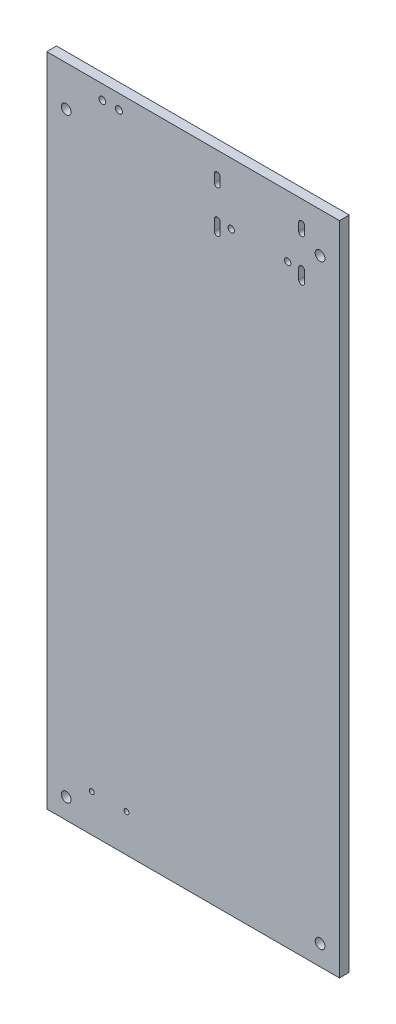
ISO-10303-21;
HEADER;
FILE_DESCRIPTION(('STEP AP214'),'2;1');
FILE_NAME('part.step','',(''),(''),'','','');
FILE_SCHEMA(('AUTOMOTIVE_DESIGN { 1 0 10303 214 1 1 1 1 }'));
ENDSEC;
DATA;
#1=APPLICATION_CONTEXT('core data for automotive mechanical design processes');
#2=APPLICATION_PROTOCOL_DEFINITION('international standard','automotive_design',2000,#1);
#3=PRODUCT_CONTEXT('',#1,'mechanical');
#4=PRODUCT('Part','Part','',(#3));
#5=PRODUCT_RELATED_PRODUCT_CATEGORY('part','',(#4));
#6=PRODUCT_DEFINITION_FORMATION('','',#4);
#7=PRODUCT_DEFINITION_CONTEXT('part definition',#1,'design');
#8=PRODUCT_DEFINITION('design','',#6,#7);
#9=PRODUCT_DEFINITION_SHAPE('','',#8);
#10=(LENGTH_UNIT() NAMED_UNIT(*) SI_UNIT(.MILLI.,.METRE.));
#11=(NAMED_UNIT(*) PLANE_ANGLE_UNIT() SI_UNIT($,.RADIAN.));
#12=(NAMED_UNIT(*) SI_UNIT($,.STERADIAN.) SOLID_ANGLE_UNIT());
#13=UNCERTAINTY_MEASURE_WITH_UNIT(LENGTH_MEASURE(1.E-05),#10,'distance_accuracy_value','');
#14=(GEOMETRIC_REPRESENTATION_CONTEXT(3) GLOBAL_UNCERTAINTY_ASSIGNED_CONTEXT((#13)) GLOBAL_UNIT_ASSIGNED_CONTEXT((#10,
#11,#12)) REPRESENTATION_CONTEXT('',''));
#15=CARTESIAN_POINT('',(0.,0.,0.));
#16=DIRECTION('',(0.,0.,1.));
#17=DIRECTION('',(1.,0.,0.));
#18=AXIS2_PLACEMENT_3D('',#15,#16,#17);
#19=CARTESIAN_POINT('',(15.050830581661,-32.90006477013,0.));
#20=DIRECTION('',(0.,0.,-1.));
#21=DIRECTION('',(-1.,0.,0.));
#22=AXIS2_PLACEMENT_3D('',#19,#20,#21);
#23=PLANE('',#22);
#24=CARTESIAN_POINT('',(28.050855981712,-64.42252984506,0.));
#25=DIRECTION('',(0.,0.,-1.));
#26=DIRECTION('',(-1.,0.,0.));
#27=AXIS2_PLACEMENT_3D('',#24,#25,#26);
#28=CIRCLE('',#27,0.5);
#29=CARTESIAN_POINT('',(27.550855981712,-64.42252984506,0.));
#30=VERTEX_POINT('',#29);
#31=EDGE_CURVE('E269',#30,#30,#28,.F.);
#32=ORIENTED_EDGE('',*,*,#31,.T.);
#33=EDGE_LOOP('',(#32));
#34=FACE_BOUND('',#33,.T.);
#35=CARTESIAN_POINT('',(28.050855981712,-3.422407924816,0.));
#36=DIRECTION('',(0.,0.,-1.));
#37=DIRECTION('',(-1.,0.,0.));
#38=AXIS2_PLACEMENT_3D('',#35,#36,#37);
#39=CIRCLE('',#38,0.5);
#40=CARTESIAN_POINT('',(27.550855981712,-3.422407924816,0.));
#41=VERTEX_POINT('',#40);
#42=EDGE_CURVE('E272',#41,#41,#39,.F.);
#43=ORIENTED_EDGE('',*,*,#42,.T.);
#44=EDGE_LOOP('',(#43));
#45=FACE_BOUND('',#44,.T.);
#46=DIRECTION('',(0.,1.,0.));
#47=VECTOR('',#46,1.);
#48=CARTESIAN_POINT('',(25.864084328169,-5.555397510795,0.));
#49=LINE('',#48,#47);
#50=CARTESIAN_POINT('',(25.864084328169,-6.655422910846,0.));
#51=VERTEX_POINT('',#50);
#52=CARTESIAN_POINT('',(25.864084328169,-5.555397510795,0.));
#53=VERTEX_POINT('',#52);
#54=EDGE_CURVE('E176',#51,#53,#49,.T.);
#55=ORIENTED_EDGE('',*,*,#54,.F.);
#56=CARTESIAN_POINT('',(26.164084328169,-6.655422910846,0.));
#57=DIRECTION('',(0.,0.,-1.));
#58=DIRECTION('',(-1.,0.,0.));
#59=AXIS2_PLACEMENT_3D('',#56,#57,#58);
#60=CIRCLE('',#59,0.3);
#61=CARTESIAN_POINT('',(26.464084328169,-6.655422910846,0.));
#62=VERTEX_POINT('',#61);
#63=EDGE_CURVE('E179',#51,#62,#60,.F.);
#64=ORIENTED_EDGE('',*,*,#63,.T.);
#65=DIRECTION('',(0.,1.,0.));
#66=VECTOR('',#65,1.);
#67=CARTESIAN_POINT('',(26.464084328169,-6.655422910846,0.));
#68=LINE('',#67,#66);
#69=CARTESIAN_POINT('',(26.464084328169,-5.555397510795,0.));
#70=VERTEX_POINT('',#69);
#71=EDGE_CURVE('E181',#70,#62,#68,.F.);
#72=ORIENTED_EDGE('',*,*,#71,.F.);
#73=CARTESIAN_POINT('',(26.164084328169,-5.555397510795,0.));
#74=DIRECTION('',(0.,0.,-1.));
#75=DIRECTION('',(-1.,0.,0.));
#76=AXIS2_PLACEMENT_3D('',#73,#74,#75);
#77=CIRCLE('',#76,0.3);
#78=EDGE_CURVE('E183',#70,#53,#77,.F.);
#79=ORIENTED_EDGE('',*,*,#78,.T.);
#80=EDGE_LOOP('',(#55,#64,#72,#79));
#81=FACE_BOUND('',#80,.T.);
#82=DIRECTION('',(0.,1.,0.));
#83=VECTOR('',#82,1.);
#84=CARTESIAN_POINT('',(25.864084328169,-1.5555499111,0.));
#85=LINE('',#84,#83);
#86=CARTESIAN_POINT('',(25.864084328169,-2.3555499111,0.));
#87=VERTEX_POINT('',#86);
#88=CARTESIAN_POINT('',(25.864084328169,-1.5555499111,0.));
#89=VERTEX_POINT('',#88);
#90=EDGE_CURVE('E185',#87,#89,#85,.T.);
#91=ORIENTED_EDGE('',*,*,#90,.F.);
#92=CARTESIAN_POINT('',(26.164084328169,-2.3555499111,0.));
#93=DIRECTION('',(0.,0.,-1.));
#94=DIRECTION('',(-1.,0.,0.));
#95=AXIS2_PLACEMENT_3D('',#92,#93,#94);
#96=CIRCLE('',#95,0.3);
#97=CARTESIAN_POINT('',(26.464084328169,-2.3555499111,0.));
#98=VERTEX_POINT('',#97);
#99=EDGE_CURVE('E188',#87,#98,#96,.F.);
#100=ORIENTED_EDGE('',*,*,#99,.T.);
#101=DIRECTION('',(0.,1.,0.));
#102=VECTOR('',#101,1.);
#103=CARTESIAN_POINT('',(26.464084328169,-2.3555499111,0.));
#104=LINE('',#103,#102);
#105=CARTESIAN_POINT('',(26.464084328169,-1.5555499111,0.));
#106=VERTEX_POINT('',#105);
#107=EDGE_CURVE('E190',#106,#98,#104,.F.);
#108=ORIENTED_EDGE('',*,*,#107,.F.);
#109=CARTESIAN_POINT('',(26.164084328169,-1.5555499111,0.));
#110=DIRECTION('',(0.,0.,-1.));
#111=DIRECTION('',(-1.,0.,0.));
#112=AXIS2_PLACEMENT_3D('',#109,#110,#111);
#113=CIRCLE('',#112,0.3);
#114=EDGE_CURVE('E192',#106,#89,#113,.F.);
#115=ORIENTED_EDGE('',*,*,#114,.T.);
#116=EDGE_LOOP('',(#91,#100,#108,#115));
#117=FACE_BOUND('',#116,.T.);
#118=CARTESIAN_POINT('',(24.734061468123,-5.60604521209,0.));
#119=DIRECTION('',(0.,0.,-1.));
#120=DIRECTION('',(-1.,0.,0.));
#121=AXIS2_PLACEMENT_3D('',#118,#119,#120);
#122=CIRCLE('',#121,0.324993649987);
#123=CARTESIAN_POINT('',(24.409067818136,-5.60604521209,0.));
#124=VERTEX_POINT('',#123);
#125=EDGE_CURVE('E193',#124,#124,#122,.F.);
#126=ORIENTED_EDGE('',*,*,#125,.T.);
#127=EDGE_LOOP('',(#126));
#128=FACE_BOUND('',#127,.T.);
#129=CARTESIAN_POINT('',(18.954025908052,-5.60604521209,0.));
#130=DIRECTION('',(0.,0.,-1.));
#131=DIRECTION('',(-1.,0.,0.));
#132=AXIS2_PLACEMENT_3D('',#129,#130,#131);
#133=CIRCLE('',#132,0.324993649987);
#134=CARTESIAN_POINT('',(18.629032258065,-5.60604521209,0.));
#135=VERTEX_POINT('',#134);
#136=EDGE_CURVE('E287',#135,#135,#133,.F.);
#137=ORIENTED_EDGE('',*,*,#136,.T.);
#138=EDGE_LOOP('',(#137));
#139=FACE_BOUND('',#138,.T.);
#140=DIRECTION('',(0.,1.,0.));
#141=VECTOR('',#140,1.);
#142=CARTESIAN_POINT('',(17.224003048006,-5.555397510795,0.));
#143=LINE('',#142,#141);
#144=CARTESIAN_POINT('',(17.224003048006,-6.655422910846,0.));
#145=VERTEX_POINT('',#144);
#146=CARTESIAN_POINT('',(17.224003048006,-5.555397510795,0.));
#147=VERTEX_POINT('',#146);
#148=EDGE_CURVE('E194',#145,#147,#143,.T.);
#149=ORIENTED_EDGE('',*,*,#148,.F.);
#150=CARTESIAN_POINT('',(17.524003048006,-6.655422910846,0.));
#151=DIRECTION('',(0.,0.,-1.));
#152=DIRECTION('',(-1.,0.,0.));
#153=AXIS2_PLACEMENT_3D('',#150,#151,#152);
#154=CIRCLE('',#153,0.3);
#155=CARTESIAN_POINT('',(17.824003048006,-6.655422910846,0.));
#156=VERTEX_POINT('',#155);
#157=EDGE_CURVE('E197',#145,#156,#154,.F.);
#158=ORIENTED_EDGE('',*,*,#157,.T.);
#159=DIRECTION('',(0.,1.,0.));
#160=VECTOR('',#159,1.);
#161=CARTESIAN_POINT('',(17.824003048006,-6.655422910846,0.));
#162=LINE('',#161,#160);
#163=CARTESIAN_POINT('',(17.824003048006,-5.555397510795,0.));
#164=VERTEX_POINT('',#163);
#165=EDGE_CURVE('E199',#164,#156,#162,.F.);
#166=ORIENTED_EDGE('',*,*,#165,.F.);
#167=CARTESIAN_POINT('',(17.524003048006,-5.555397510795,0.));
#168=DIRECTION('',(0.,0.,-1.));
#169=DIRECTION('',(-1.,0.,0.));
#170=AXIS2_PLACEMENT_3D('',#167,#168,#169);
#171=CIRCLE('',#170,0.3);
#172=EDGE_CURVE('E201',#164,#147,#171,.F.);
#173=ORIENTED_EDGE('',*,*,#172,.T.);
#174=EDGE_LOOP('',(#149,#158,#166,#173));
#175=FACE_BOUND('',#174,.T.);
#176=DIRECTION('',(0.,1.,0.));
#177=VECTOR('',#176,1.);
#178=CARTESIAN_POINT('',(17.224003048006,-1.5555499111,0.));
#179=LINE('',#178,#177);
#180=CARTESIAN_POINT('',(17.224003048006,-2.3555499111,0.));
#181=VERTEX_POINT('',#180);
#182=CARTESIAN_POINT('',(17.224003048006,-1.5555499111,0.));
#183=VERTEX_POINT('',#182);
#184=EDGE_CURVE('E203',#181,#183,#179,.T.);
#185=ORIENTED_EDGE('',*,*,#184,.F.);
#186=CARTESIAN_POINT('',(17.524003048006,-2.3555499111,0.));
#187=DIRECTION('',(0.,0.,-1.));
#188=DIRECTION('',(-1.,0.,0.));
#189=AXIS2_PLACEMENT_3D('',#186,#187,#188);
#190=CIRCLE('',#189,0.3);
#191=CARTESIAN_POINT('',(17.824003048006,-2.3555499111,0.));
#192=VERTEX_POINT('',#191);
#193=EDGE_CURVE('E206',#181,#192,#190,.F.);
#194=ORIENTED_EDGE('',*,*,#193,.T.);
#195=DIRECTION('',(0.,1.,0.));
#196=VECTOR('',#195,1.);
#197=CARTESIAN_POINT('',(17.824003048006,-2.3555499111,0.));
#198=LINE('',#197,#196);
#199=CARTESIAN_POINT('',(17.824003048006,-1.5555499111,0.));
#200=VERTEX_POINT('',#199);
#201=EDGE_CURVE('E208',#200,#192,#198,.F.);
#202=ORIENTED_EDGE('',*,*,#201,.F.);
#203=CARTESIAN_POINT('',(17.524003048006,-1.5555499111,0.));
#204=DIRECTION('',(0.,0.,-1.));
#205=DIRECTION('',(-1.,0.,0.));
#206=AXIS2_PLACEMENT_3D('',#203,#204,#205);
#207=CIRCLE('',#206,0.3);
#208=EDGE_CURVE('E133',#200,#183,#207,.F.);
#209=ORIENTED_EDGE('',*,*,#208,.T.);
#210=EDGE_LOOP('',(#185,#194,#202,#209));
#211=FACE_BOUND('',#210,.T.);
#212=CARTESIAN_POINT('',(8.229616459233,-62.63652527305,0.));
#213=DIRECTION('',(0.,0.,-1.));
#214=DIRECTION('',(-1.,0.,0.));
#215=AXIS2_PLACEMENT_3D('',#212,#213,#214);
#216=CIRCLE('',#215,0.25);
#217=CARTESIAN_POINT('',(7.979616459233,-62.63652527305,0.));
#218=VERTEX_POINT('',#217);
#219=EDGE_CURVE('E209',#218,#218,#216,.F.);
#220=ORIENTED_EDGE('',*,*,#219,.T.);
#221=EDGE_LOOP('',(#220));
#222=FACE_BOUND('',#221,.T.);
#223=CARTESIAN_POINT('',(7.454152908306,-0.784353568707,0.));
#224=DIRECTION('',(0.,0.,-1.));
#225=DIRECTION('',(-1.,0.,0.));
#226=AXIS2_PLACEMENT_3D('',#223,#224,#225);
#227=CIRCLE('',#226,0.350012700025);
#228=CARTESIAN_POINT('',(7.104140208281,-0.784353568707,0.));
#229=VERTEX_POINT('',#228);
#230=EDGE_CURVE('E303',#229,#229,#227,.F.);
#231=ORIENTED_EDGE('',*,*,#230,.T.);
#232=EDGE_LOOP('',(#231));
#233=FACE_BOUND('',#232,.T.);
#234=CARTESIAN_POINT('',(5.754127508255,-0.784353568707,0.));
#235=DIRECTION('',(0.,0.,-1.));
#236=DIRECTION('',(-1.,0.,0.));
#237=AXIS2_PLACEMENT_3D('',#234,#235,#236);
#238=CIRCLE('',#237,0.350012700025);
#239=CARTESIAN_POINT('',(5.40411480823,-0.784353568707,0.));
#240=VERTEX_POINT('',#239);
#241=EDGE_CURVE('E306',#240,#240,#238,.F.);
#242=ORIENTED_EDGE('',*,*,#241,.T.);
#243=EDGE_LOOP('',(#242));
#244=FACE_BOUND('',#243,.T.);
#245=CARTESIAN_POINT('',(4.673609347219,-62.63652527305,0.));
#246=DIRECTION('',(0.,0.,-1.));
#247=DIRECTION('',(-1.,0.,0.));
#248=AXIS2_PLACEMENT_3D('',#245,#246,#247);
#249=CIRCLE('',#248,0.25);
#250=CARTESIAN_POINT('',(4.423609347219,-62.63652527305,0.));
#251=VERTEX_POINT('',#250);
#252=EDGE_CURVE('E309',#251,#251,#249,.F.);
#253=ORIENTED_EDGE('',*,*,#252,.T.);
#254=EDGE_LOOP('',(#253));
#255=FACE_BOUND('',#254,.T.);
#256=CARTESIAN_POINT('',(2.05080518161,-3.422407924816,0.));
#257=DIRECTION('',(0.,0.,-1.));
#258=DIRECTION('',(-1.,0.,0.));
#259=AXIS2_PLACEMENT_3D('',#256,#257,#258);
#260=CIRCLE('',#259,0.5);
#261=CARTESIAN_POINT('',(1.55080518161,-3.422407924816,0.));
#262=VERTEX_POINT('',#261);
#263=EDGE_CURVE('E311',#262,#262,#260,.F.);
#264=ORIENTED_EDGE('',*,*,#263,.T.);
#265=EDGE_LOOP('',(#264));
#266=FACE_BOUND('',#265,.T.);
#267=CARTESIAN_POINT('',(2.05080518161,-64.42252984506,0.));
#268=DIRECTION('',(0.,0.,-1.));
#269=DIRECTION('',(-1.,0.,0.));
#270=AXIS2_PLACEMENT_3D('',#267,#268,#269);
#271=CIRCLE('',#270,0.5);
#272=CARTESIAN_POINT('',(1.55080518161,-64.42252984506,0.));
#273=VERTEX_POINT('',#272);
#274=EDGE_CURVE('E20',#273,#273,#271,.F.);
#275=ORIENTED_EDGE('',*,*,#274,.T.);
#276=EDGE_LOOP('',(#275));
#277=FACE_BOUND('',#276,.T.);
#278=DIRECTION('',(1.,0.,0.));
#279=VECTOR('',#278,1.);
#280=CARTESIAN_POINT('',(30.038161036322,-66.48743205486,0.));
#281=LINE('',#280,#279);
#282=CARTESIAN_POINT('',(0.0635001270002508,-66.48743205486,0.));
#283=VERTEX_POINT('',#282);
#284=CARTESIAN_POINT('',(30.038161036322,-66.48743205486,0.));
#285=VERTEX_POINT('',#284);
#286=EDGE_CURVE('E329',#283,#285,#281,.T.);
#287=ORIENTED_EDGE('',*,*,#286,.F.);
#288=DIRECTION('',(0.,-1.,0.));
#289=VECTOR('',#288,1.);
#290=CARTESIAN_POINT('',(0.06350012700025,-66.48743205486,0.));
#291=LINE('',#290,#289);
#292=CARTESIAN_POINT('',(0.0635001270002564,0.687302514604999,0.));
#293=VERTEX_POINT('',#292);
#294=EDGE_CURVE('E157',#293,#283,#291,.T.);
#295=ORIENTED_EDGE('',*,*,#294,.F.);
#296=DIRECTION('',(1.,0.,0.));
#297=VECTOR('',#296,1.);
#298=CARTESIAN_POINT('',(0.06350012700026,0.687302514605,0.));
#299=LINE('',#298,#297);
#300=CARTESIAN_POINT('',(30.038161036322,0.687302514605,0.));
#301=VERTEX_POINT('',#300);
#302=EDGE_CURVE('E142',#301,#293,#299,.F.);
#303=ORIENTED_EDGE('',*,*,#302,.F.);
#304=DIRECTION('',(0.,1.,0.));
#305=VECTOR('',#304,1.);
#306=CARTESIAN_POINT('',(30.038161036322,0.687302514605,0.));
#307=LINE('',#306,#305);
#308=EDGE_CURVE('E153',#285,#301,#307,.T.);
#309=ORIENTED_EDGE('',*,*,#308,.F.);
#310=EDGE_LOOP('',(#287,#295,#303,#309));
#311=FACE_BOUND('',#310,.T.);
#312=ADVANCED_FACE('F17',(#34,#45,#81,#117,#128,#139,#175,#211,#222,#233,#244,#255,#266,#277,
#311),#23,.T.);
#313=CARTESIAN_POINT('',(0.06350012700026,0.687302514605,0.));
#314=DIRECTION('',(0.,1.,0.));
#315=DIRECTION('',(0.,0.,1.));
#316=AXIS2_PLACEMENT_3D('',#313,#314,#315);
#317=PLANE('',#316);
#318=DIRECTION('',(0.,0.,1.));
#319=VECTOR('',#318,1.);
#320=CARTESIAN_POINT('',(30.038161036322,0.687302514605,0.));
#321=LINE('',#320,#319);
#322=CARTESIAN_POINT('',(30.038161036322,0.687302514605,1.000025400051));
#323=VERTEX_POINT('',#322);
#324=EDGE_CURVE('E158',#301,#323,#321,.T.);
#325=ORIENTED_EDGE('',*,*,#324,.F.);
#326=ORIENTED_EDGE('',*,*,#302,.T.);
#327=DIRECTION('',(0.,0.,1.));
#328=VECTOR('',#327,1.);
#329=CARTESIAN_POINT('',(0.0635001270002558,0.687302514604998,0.));
#330=LINE('',#329,#328);
#331=CARTESIAN_POINT('',(0.0635001270002564,0.687302514604999,1.000025400051));
#332=VERTEX_POINT('',#331);
#333=EDGE_CURVE('E318',#332,#293,#330,.F.);
#334=ORIENTED_EDGE('',*,*,#333,.F.);
#335=DIRECTION('',(-1.,0.,0.));
#336=VECTOR('',#335,1.);
#337=CARTESIAN_POINT('',(15.050830581661,0.687302514604998,1.000025400051));
#338=LINE('',#337,#336);
#339=EDGE_CURVE('E172',#332,#323,#338,.F.);
#340=ORIENTED_EDGE('',*,*,#339,.T.);
#341=EDGE_LOOP('',(#325,#326,#334,#340));
#342=FACE_BOUND('',#341,.T.);
#343=ADVANCED_FACE('F170',(#342),#317,.T.);
#344=CARTESIAN_POINT('',(30.038161036322,0.687302514605,0.));
#345=DIRECTION('',(1.,0.,0.));
#346=DIRECTION('',(0.,1.,0.));
#347=AXIS2_PLACEMENT_3D('',#344,#345,#346);
#348=PLANE('',#347);
#349=DIRECTION('',(0.,0.,-1.));
#350=VECTOR('',#349,1.);
#351=CARTESIAN_POINT('',(30.038161036322,-66.48743205486,0.));
#352=LINE('',#351,#350);
#353=CARTESIAN_POINT('',(30.038161036322,-66.48743205486,1.000025400051));
#354=VERTEX_POINT('',#353);
#355=EDGE_CURVE('E167',#285,#354,#352,.F.);
#356=ORIENTED_EDGE('',*,*,#355,.F.);
#357=ORIENTED_EDGE('',*,*,#308,.T.);
#358=ORIENTED_EDGE('',*,*,#324,.T.);
#359=DIRECTION('',(0.,1.,0.));
#360=VECTOR('',#359,1.);
#361=CARTESIAN_POINT('',(30.038161036322,-32.90006477013,1.000025400051));
#362=LINE('',#361,#360);
#363=EDGE_CURVE('E340',#323,#354,#362,.F.);
#364=ORIENTED_EDGE('',*,*,#363,.T.);
#365=EDGE_LOOP('',(#356,#357,#358,#364));
#366=FACE_BOUND('',#365,.T.);
#367=ADVANCED_FACE('F163',(#366),#348,.T.);
#368=CARTESIAN_POINT('',(30.038161036322,-66.48743205486,0.));
#369=DIRECTION('',(0.,-1.,0.));
#370=DIRECTION('',(0.,0.,-1.));
#371=AXIS2_PLACEMENT_3D('',#368,#369,#370);
#372=PLANE('',#371);
#373=DIRECTION('',(0.,0.,1.));
#374=VECTOR('',#373,1.);
#375=CARTESIAN_POINT('',(0.06350012700025,-66.48743205486,0.));
#376=LINE('',#375,#374);
#377=CARTESIAN_POINT('',(0.0635001270002508,-66.48743205486,1.000025400051));
#378=VERTEX_POINT('',#377);
#379=EDGE_CURVE('E323',#283,#378,#376,.T.);
#380=ORIENTED_EDGE('',*,*,#379,.F.);
#381=ORIENTED_EDGE('',*,*,#286,.T.);
#382=ORIENTED_EDGE('',*,*,#355,.T.);
#383=DIRECTION('',(-1.,0.,0.));
#384=VECTOR('',#383,1.);
#385=CARTESIAN_POINT('',(15.050830581661,-66.48743205486,1.000025400051));
#386=LINE('',#385,#384);
#387=EDGE_CURVE('E335',#354,#378,#386,.T.);
#388=ORIENTED_EDGE('',*,*,#387,.T.);
#389=EDGE_LOOP('',(#380,#381,#382,#388));
#390=FACE_BOUND('',#389,.T.);
#391=ADVANCED_FACE('F334',(#390),#372,.T.);
#392=CARTESIAN_POINT('',(0.06350012700025,-66.48743205486,0.));
#393=DIRECTION('',(-1.,0.,0.));
#394=DIRECTION('',(0.,-1.,0.));
#395=AXIS2_PLACEMENT_3D('',#392,#393,#394);
#396=PLANE('',#395);
#397=ORIENTED_EDGE('',*,*,#333,.T.);
#398=ORIENTED_EDGE('',*,*,#294,.T.);
#399=ORIENTED_EDGE('',*,*,#379,.T.);
#400=DIRECTION('',(0.,1.,0.));
#401=VECTOR('',#400,1.);
#402=CARTESIAN_POINT('',(0.0635001270002499,-32.90006477013,1.000025400051));
#403=LINE('',#402,#401);
#404=EDGE_CURVE('E268',#378,#332,#403,.T.);
#405=ORIENTED_EDGE('',*,*,#404,.T.);
#406=EDGE_LOOP('',(#397,#398,#399,#405));
#407=FACE_BOUND('',#406,.T.);
#408=ADVANCED_FACE('F387',(#407),#396,.T.);
#409=CARTESIAN_POINT('',(2.05080518161,-64.42252984506,0.));
#410=DIRECTION('',(0.,0.,-1.));
#411=DIRECTION('',(-1.,0.,0.));
#412=AXIS2_PLACEMENT_3D('',#409,#410,#411);
#413=CYLINDRICAL_SURFACE('',#412,0.5);
#414=CARTESIAN_POINT('',(2.05080518161,-64.42252984506,1.000025400051));
#415=DIRECTION('',(0.,0.,-1.));
#416=DIRECTION('',(-1.,0.,0.));
#417=AXIS2_PLACEMENT_3D('',#414,#415,#416);
#418=CIRCLE('',#417,0.5);
#419=CARTESIAN_POINT('',(1.55080518161,-64.42252984506,1.000025400051));
#420=VERTEX_POINT('',#419);
#421=EDGE_CURVE('E265',#420,#420,#418,.F.);
#422=ORIENTED_EDGE('',*,*,#421,.T.);
#423=EDGE_LOOP('',(#422));
#424=FACE_BOUND('',#423,.T.);
#425=ORIENTED_EDGE('',*,*,#274,.F.);
#426=EDGE_LOOP('',(#425));
#427=FACE_BOUND('',#426,.T.);
#428=ADVANCED_FACE('F390',(#424,#427),#413,.F.);
#429=CARTESIAN_POINT('',(2.05080518161,-3.422407924816,0.));
#430=DIRECTION('',(0.,0.,-1.));
#431=DIRECTION('',(-1.,0.,0.));
#432=AXIS2_PLACEMENT_3D('',#429,#430,#431);
#433=CYLINDRICAL_SURFACE('',#432,0.5);
#434=CARTESIAN_POINT('',(2.05080518161,-3.422407924816,1.000025400051));
#435=DIRECTION('',(0.,0.,-1.));
#436=DIRECTION('',(-1.,0.,0.));
#437=AXIS2_PLACEMENT_3D('',#434,#435,#436);
#438=CIRCLE('',#437,0.5);
#439=CARTESIAN_POINT('',(1.55080518161,-3.422407924816,1.000025400051));
#440=VERTEX_POINT('',#439);
#441=EDGE_CURVE('E262',#440,#440,#438,.F.);
#442=ORIENTED_EDGE('',*,*,#441,.T.);
#443=EDGE_LOOP('',(#442));
#444=FACE_BOUND('',#443,.T.);
#445=ORIENTED_EDGE('',*,*,#263,.F.);
#446=EDGE_LOOP('',(#445));
#447=FACE_BOUND('',#446,.T.);
#448=ADVANCED_FACE('F397',(#444,#447),#433,.F.);
#449=CARTESIAN_POINT('',(4.673609347219,-62.63652527305,0.));
#450=DIRECTION('',(0.,0.,-1.));
#451=DIRECTION('',(-1.,0.,0.));
#452=AXIS2_PLACEMENT_3D('',#449,#450,#451);
#453=CYLINDRICAL_SURFACE('',#452,0.25);
#454=CARTESIAN_POINT('',(4.673609347219,-62.63652527305,1.000025400051));
#455=DIRECTION('',(0.,0.,-1.));
#456=DIRECTION('',(-1.,0.,0.));
#457=AXIS2_PLACEMENT_3D('',#454,#455,#456);
#458=CIRCLE('',#457,0.25);
#459=CARTESIAN_POINT('',(4.423609347219,-62.63652527305,1.000025400051));
#460=VERTEX_POINT('',#459);
#461=EDGE_CURVE('E259',#460,#460,#458,.F.);
#462=ORIENTED_EDGE('',*,*,#461,.T.);
#463=EDGE_LOOP('',(#462));
#464=FACE_BOUND('',#463,.T.);
#465=ORIENTED_EDGE('',*,*,#252,.F.);
#466=EDGE_LOOP('',(#465));
#467=FACE_BOUND('',#466,.T.);
#468=ADVANCED_FACE('F494',(#464,#467),#453,.F.);
#469=CARTESIAN_POINT('',(5.754127508255,-0.784353568707,0.));
#470=DIRECTION('',(0.,0.,-1.));
#471=DIRECTION('',(-1.,0.,0.));
#472=AXIS2_PLACEMENT_3D('',#469,#470,#471);
#473=CYLINDRICAL_SURFACE('',#472,0.350012700025);
#474=CARTESIAN_POINT('',(5.754127508255,-0.784353568707,1.000025400051));
#475=DIRECTION('',(0.,0.,-1.));
#476=DIRECTION('',(-1.,0.,0.));
#477=AXIS2_PLACEMENT_3D('',#474,#475,#476);
#478=CIRCLE('',#477,0.350012700025);
#479=CARTESIAN_POINT('',(5.40411480823,-0.784353568707,1.000025400051));
#480=VERTEX_POINT('',#479);
#481=EDGE_CURVE('E256',#480,#480,#478,.F.);
#482=ORIENTED_EDGE('',*,*,#481,.T.);
#483=EDGE_LOOP('',(#482));
#484=FACE_BOUND('',#483,.T.);
#485=ORIENTED_EDGE('',*,*,#241,.F.);
#486=EDGE_LOOP('',(#485));
#487=FACE_BOUND('',#486,.T.);
#488=ADVANCED_FACE('F490',(#484,#487),#473,.F.);
#489=CARTESIAN_POINT('',(7.454152908306,-0.784353568707,0.));
#490=DIRECTION('',(0.,0.,-1.));
#491=DIRECTION('',(-1.,0.,0.));
#492=AXIS2_PLACEMENT_3D('',#489,#490,#491);
#493=CYLINDRICAL_SURFACE('',#492,0.350012700025);
#494=CARTESIAN_POINT('',(7.454152908306,-0.784353568707,1.000025400051));
#495=DIRECTION('',(0.,0.,-1.));
#496=DIRECTION('',(-1.,0.,0.));
#497=AXIS2_PLACEMENT_3D('',#494,#495,#496);
#498=CIRCLE('',#497,0.350012700025);
#499=CARTESIAN_POINT('',(7.104140208281,-0.784353568707,1.000025400051));
#500=VERTEX_POINT('',#499);
#501=EDGE_CURVE('E253',#500,#500,#498,.F.);
#502=ORIENTED_EDGE('',*,*,#501,.T.);
#503=EDGE_LOOP('',(#502));
#504=FACE_BOUND('',#503,.T.);
#505=ORIENTED_EDGE('',*,*,#230,.F.);
#506=EDGE_LOOP('',(#505));
#507=FACE_BOUND('',#506,.T.);
#508=ADVANCED_FACE('F486',(#504,#507),#493,.F.);
#509=CARTESIAN_POINT('',(8.229616459233,-62.63652527305,0.));
#510=DIRECTION('',(0.,0.,-1.));
#511=DIRECTION('',(-1.,0.,0.));
#512=AXIS2_PLACEMENT_3D('',#509,#510,#511);
#513=CYLINDRICAL_SURFACE('',#512,0.25);
#514=CARTESIAN_POINT('',(8.229616459233,-62.63652527305,1.000025400051));
#515=DIRECTION('',(0.,0.,-1.));
#516=DIRECTION('',(-1.,0.,0.));
#517=AXIS2_PLACEMENT_3D('',#514,#515,#516);
#518=CIRCLE('',#517,0.25);
#519=CARTESIAN_POINT('',(7.979616459233,-62.63652527305,1.000025400051));
#520=VERTEX_POINT('',#519);
#521=EDGE_CURVE('E250',#520,#520,#518,.F.);
#522=ORIENTED_EDGE('',*,*,#521,.T.);
#523=EDGE_LOOP('',(#522));
#524=FACE_BOUND('',#523,.T.);
#525=ORIENTED_EDGE('',*,*,#219,.F.);
#526=EDGE_LOOP('',(#525));
#527=FACE_BOUND('',#526,.T.);
#528=ADVANCED_FACE('F483',(#524,#527),#513,.F.);
#529=CARTESIAN_POINT('',(17.824003048006,-2.3555499111,0.));
#530=DIRECTION('',(-1.,0.,0.));
#531=DIRECTION('',(0.,0.,1.));
#532=AXIS2_PLACEMENT_3D('',#529,#530,#531);
#533=PLANE('',#532);
#534=DIRECTION('',(0.,0.,-1.));
#535=VECTOR('',#534,1.);
#536=CARTESIAN_POINT('',(17.824003048006,-1.5555499111,0.));
#537=LINE('',#536,#535);
#538=CARTESIAN_POINT('',(17.824003048006,-1.5555499111,1.000025400051));
#539=VERTEX_POINT('',#538);
#540=EDGE_CURVE('E300',#539,#200,#537,.T.);
#541=ORIENTED_EDGE('',*,*,#540,.T.);
#542=ORIENTED_EDGE('',*,*,#201,.T.);
#543=DIRECTION('',(0.,0.,-1.));
#544=VECTOR('',#543,1.);
#545=CARTESIAN_POINT('',(17.824003048006,-2.3555499111,0.));
#546=LINE('',#545,#544);
#547=CARTESIAN_POINT('',(17.824003048006,-2.3555499111,1.000025400051));
#548=VERTEX_POINT('',#547);
#549=EDGE_CURVE('E298',#192,#548,#546,.F.);
#550=ORIENTED_EDGE('',*,*,#549,.T.);
#551=DIRECTION('',(0.,1.,0.));
#552=VECTOR('',#551,1.);
#553=CARTESIAN_POINT('',(17.824003048006,-32.90006477013,1.000025400051));
#554=LINE('',#553,#552);
#555=EDGE_CURVE('E249',#548,#539,#554,.T.);
#556=ORIENTED_EDGE('',*,*,#555,.T.);
#557=EDGE_LOOP('',(#541,#542,#550,#556));
#558=FACE_BOUND('',#557,.T.);
#559=ADVANCED_FACE('F376',(#558),#533,.T.);
#560=CARTESIAN_POINT('',(17.524003048006,-1.5555499111,0.));
#561=DIRECTION('',(0.,0.,-1.));
#562=DIRECTION('',(-1.,0.,0.));
#563=AXIS2_PLACEMENT_3D('',#560,#561,#562);
#564=CYLINDRICAL_SURFACE('',#563,0.3);
#565=CARTESIAN_POINT('',(17.524003048006,-1.5555499111,1.000025400051));
#566=DIRECTION('',(0.,0.,-1.));
#567=DIRECTION('',(-1.,0.,0.));
#568=AXIS2_PLACEMENT_3D('',#565,#566,#567);
#569=CIRCLE('',#568,0.3);
#570=CARTESIAN_POINT('',(17.224003048006,-1.5555499111,1.000025400051));
#571=VERTEX_POINT('',#570);
#572=EDGE_CURVE('E246',#539,#571,#569,.F.);
#573=ORIENTED_EDGE('',*,*,#572,.T.);
#574=DIRECTION('',(0.,0.,-1.));
#575=VECTOR('',#574,1.);
#576=CARTESIAN_POINT('',(17.224003048006,-1.5555499111,0.));
#577=LINE('',#576,#575);
#578=EDGE_CURVE('E207',#183,#571,#577,.F.);
#579=ORIENTED_EDGE('',*,*,#578,.F.);
#580=ORIENTED_EDGE('',*,*,#208,.F.);
#581=ORIENTED_EDGE('',*,*,#540,.F.);
#582=EDGE_LOOP('',(#573,#579,#580,#581));
#583=FACE_BOUND('',#582,.T.);
#584=ADVANCED_FACE('F379',(#583),#564,.F.);
#585=CARTESIAN_POINT('',(17.224003048006,-1.5555499111,0.));
#586=DIRECTION('',(1.,0.,0.));
#587=DIRECTION('',(0.,0.,-1.));
#588=AXIS2_PLACEMENT_3D('',#585,#586,#587);
#589=PLANE('',#588);
#590=DIRECTION('',(0.,0.,-1.));
#591=VECTOR('',#590,1.);
#592=CARTESIAN_POINT('',(17.224003048006,-2.3555499111,0.));
#593=LINE('',#592,#591);
#594=CARTESIAN_POINT('',(17.224003048006,-2.3555499111,1.000025400051));
#595=VERTEX_POINT('',#594);
#596=EDGE_CURVE('E202',#595,#181,#593,.T.);
#597=ORIENTED_EDGE('',*,*,#596,.T.);
#598=ORIENTED_EDGE('',*,*,#184,.T.);
#599=ORIENTED_EDGE('',*,*,#578,.T.);
#600=DIRECTION('',(0.,1.,0.));
#601=VECTOR('',#600,1.);
#602=CARTESIAN_POINT('',(17.224003048006,-32.90006477013,1.000025400051));
#603=LINE('',#602,#601);
#604=EDGE_CURVE('E245',#571,#595,#603,.F.);
#605=ORIENTED_EDGE('',*,*,#604,.T.);
#606=EDGE_LOOP('',(#597,#598,#599,#605));
#607=FACE_BOUND('',#606,.T.);
#608=ADVANCED_FACE('F475',(#607),#589,.T.);
#609=CARTESIAN_POINT('',(17.524003048006,-2.3555499111,0.));
#610=DIRECTION('',(0.,0.,-1.));
#611=DIRECTION('',(-1.,0.,0.));
#612=AXIS2_PLACEMENT_3D('',#609,#610,#611);
#613=CYLINDRICAL_SURFACE('',#612,0.3);
#614=CARTESIAN_POINT('',(17.524003048006,-2.3555499111,1.000025400051));
#615=DIRECTION('',(0.,0.,-1.));
#616=DIRECTION('',(-1.,0.,0.));
#617=AXIS2_PLACEMENT_3D('',#614,#615,#616);
#618=CIRCLE('',#617,0.3);
#619=EDGE_CURVE('E242',#595,#548,#618,.F.);
#620=ORIENTED_EDGE('',*,*,#619,.T.);
#621=ORIENTED_EDGE('',*,*,#549,.F.);
#622=ORIENTED_EDGE('',*,*,#193,.F.);
#623=ORIENTED_EDGE('',*,*,#596,.F.);
#624=EDGE_LOOP('',(#620,#621,#622,#623));
#625=FACE_BOUND('',#624,.T.);
#626=ADVANCED_FACE('F471',(#625),#613,.F.);
#627=CARTESIAN_POINT('',(17.824003048006,-6.655422910846,0.));
#628=DIRECTION('',(-1.,0.,0.));
#629=DIRECTION('',(0.,0.,1.));
#630=AXIS2_PLACEMENT_3D('',#627,#628,#629);
#631=PLANE('',#630);
#632=DIRECTION('',(0.,0.,-1.));
#633=VECTOR('',#632,1.);
#634=CARTESIAN_POINT('',(17.824003048006,-5.555397510795,0.));
#635=LINE('',#634,#633);
#636=CARTESIAN_POINT('',(17.824003048006,-5.555397510795,1.000025400051));
#637=VERTEX_POINT('',#636);
#638=EDGE_CURVE('E295',#637,#164,#635,.T.);
#639=ORIENTED_EDGE('',*,*,#638,.T.);
#640=ORIENTED_EDGE('',*,*,#165,.T.);
#641=DIRECTION('',(0.,0.,-1.));
#642=VECTOR('',#641,1.);
#643=CARTESIAN_POINT('',(17.824003048006,-6.655422910846,0.));
#644=LINE('',#643,#642);
#645=CARTESIAN_POINT('',(17.824003048006,-6.655422910846,1.000025400051));
#646=VERTEX_POINT('',#645);
#647=EDGE_CURVE('E293',#156,#646,#644,.F.);
#648=ORIENTED_EDGE('',*,*,#647,.T.);
#649=DIRECTION('',(0.,1.,0.));
#650=VECTOR('',#649,1.);
#651=CARTESIAN_POINT('',(17.824003048006,-32.90006477013,1.000025400051));
#652=LINE('',#651,#650);
#653=EDGE_CURVE('E241',#646,#637,#652,.T.);
#654=ORIENTED_EDGE('',*,*,#653,.T.);
#655=EDGE_LOOP('',(#639,#640,#648,#654));
#656=FACE_BOUND('',#655,.T.);
#657=ADVANCED_FACE('F467',(#656),#631,.T.);
#658=CARTESIAN_POINT('',(17.524003048006,-5.555397510795,0.));
#659=DIRECTION('',(0.,0.,-1.));
#660=DIRECTION('',(-1.,0.,0.));
#661=AXIS2_PLACEMENT_3D('',#658,#659,#660);
#662=CYLINDRICAL_SURFACE('',#661,0.3);
#663=CARTESIAN_POINT('',(17.524003048006,-5.555397510795,1.000025400051));
#664=DIRECTION('',(0.,0.,-1.));
#665=DIRECTION('',(-1.,0.,0.));
#666=AXIS2_PLACEMENT_3D('',#663,#664,#665);
#667=CIRCLE('',#666,0.3);
#668=CARTESIAN_POINT('',(17.224003048006,-5.555397510795,1.000025400051));
#669=VERTEX_POINT('',#668);
#670=EDGE_CURVE('E238',#637,#669,#667,.F.);
#671=ORIENTED_EDGE('',*,*,#670,.T.);
#672=DIRECTION('',(0.,0.,-1.));
#673=VECTOR('',#672,1.);
#674=CARTESIAN_POINT('',(17.224003048006,-5.555397510795,0.));
#675=LINE('',#674,#673);
#676=EDGE_CURVE('E198',#147,#669,#675,.F.);
#677=ORIENTED_EDGE('',*,*,#676,.F.);
#678=ORIENTED_EDGE('',*,*,#172,.F.);
#679=ORIENTED_EDGE('',*,*,#638,.F.);
#680=EDGE_LOOP('',(#671,#677,#678,#679));
#681=FACE_BOUND('',#680,.T.);
#682=ADVANCED_FACE('F463',(#681),#662,.F.);
#683=CARTESIAN_POINT('',(17.224003048006,-5.555397510795,0.));
#684=DIRECTION('',(1.,0.,0.));
#685=DIRECTION('',(0.,0.,-1.));
#686=AXIS2_PLACEMENT_3D('',#683,#684,#685);
#687=PLANE('',#686);
#688=DIRECTION('',(0.,0.,-1.));
#689=VECTOR('',#688,1.);
#690=CARTESIAN_POINT('',(17.224003048006,-6.655422910846,0.));
#691=LINE('',#690,#689);
#692=CARTESIAN_POINT('',(17.224003048006,-6.655422910846,1.000025400051));
#693=VERTEX_POINT('',#692);
#694=EDGE_CURVE('E290',#693,#145,#691,.T.);
#695=ORIENTED_EDGE('',*,*,#694,.T.);
#696=ORIENTED_EDGE('',*,*,#148,.T.);
#697=ORIENTED_EDGE('',*,*,#676,.T.);
#698=DIRECTION('',(0.,1.,0.));
#699=VECTOR('',#698,1.);
#700=CARTESIAN_POINT('',(17.224003048006,-32.90006477013,1.000025400051));
#701=LINE('',#700,#699);
#702=EDGE_CURVE('E237',#669,#693,#701,.F.);
#703=ORIENTED_EDGE('',*,*,#702,.T.);
#704=EDGE_LOOP('',(#695,#696,#697,#703));
#705=FACE_BOUND('',#704,.T.);
#706=ADVANCED_FACE('F459',(#705),#687,.T.);
#707=CARTESIAN_POINT('',(17.524003048006,-6.655422910846,0.));
#708=DIRECTION('',(0.,0.,-1.));
#709=DIRECTION('',(-1.,0.,0.));
#710=AXIS2_PLACEMENT_3D('',#707,#708,#709);
#711=CYLINDRICAL_SURFACE('',#710,0.3);
#712=CARTESIAN_POINT('',(17.524003048006,-6.655422910846,1.000025400051));
#713=DIRECTION('',(0.,0.,-1.));
#714=DIRECTION('',(-1.,0.,0.));
#715=AXIS2_PLACEMENT_3D('',#712,#713,#714);
#716=CIRCLE('',#715,0.3);
#717=EDGE_CURVE('E234',#693,#646,#716,.F.);
#718=ORIENTED_EDGE('',*,*,#717,.T.);
#719=ORIENTED_EDGE('',*,*,#647,.F.);
#720=ORIENTED_EDGE('',*,*,#157,.F.);
#721=ORIENTED_EDGE('',*,*,#694,.F.);
#722=EDGE_LOOP('',(#718,#719,#720,#721));
#723=FACE_BOUND('',#722,.T.);
#724=ADVANCED_FACE('F455',(#723),#711,.F.);
#725=CARTESIAN_POINT('',(18.954025908052,-5.60604521209,0.));
#726=DIRECTION('',(0.,0.,-1.));
#727=DIRECTION('',(-1.,0.,0.));
#728=AXIS2_PLACEMENT_3D('',#725,#726,#727);
#729=CYLINDRICAL_SURFACE('',#728,0.324993649987);
#730=CARTESIAN_POINT('',(18.954025908052,-5.60604521209,1.000025400051));
#731=DIRECTION('',(0.,0.,-1.));
#732=DIRECTION('',(-1.,0.,0.));
#733=AXIS2_PLACEMENT_3D('',#730,#731,#732);
#734=CIRCLE('',#733,0.324993649987);
#735=CARTESIAN_POINT('',(18.629032258065,-5.60604521209,1.000025400051));
#736=VERTEX_POINT('',#735);
#737=EDGE_CURVE('E231',#736,#736,#734,.F.);
#738=ORIENTED_EDGE('',*,*,#737,.T.);
#739=EDGE_LOOP('',(#738));
#740=FACE_BOUND('',#739,.T.);
#741=ORIENTED_EDGE('',*,*,#136,.F.);
#742=EDGE_LOOP('',(#741));
#743=FACE_BOUND('',#742,.T.);
#744=ADVANCED_FACE('F451',(#740,#743),#729,.F.);
#745=CARTESIAN_POINT('',(24.734061468123,-5.60604521209,0.));
#746=DIRECTION('',(0.,0.,-1.));
#747=DIRECTION('',(-1.,0.,0.));
#748=AXIS2_PLACEMENT_3D('',#745,#746,#747);
#749=CYLINDRICAL_SURFACE('',#748,0.324993649987);
#750=CARTESIAN_POINT('',(24.734061468123,-5.60604521209,1.000025400051));
#751=DIRECTION('',(0.,0.,-1.));
#752=DIRECTION('',(-1.,0.,0.));
#753=AXIS2_PLACEMENT_3D('',#750,#751,#752);
#754=CIRCLE('',#753,0.324993649987);
#755=CARTESIAN_POINT('',(24.409067818136,-5.60604521209,1.000025400051));
#756=VERTEX_POINT('',#755);
#757=EDGE_CURVE('E228',#756,#756,#754,.F.);
#758=ORIENTED_EDGE('',*,*,#757,.T.);
#759=EDGE_LOOP('',(#758));
#760=FACE_BOUND('',#759,.T.);
#761=ORIENTED_EDGE('',*,*,#125,.F.);
#762=EDGE_LOOP('',(#761));
#763=FACE_BOUND('',#762,.T.);
#764=ADVANCED_FACE('F447',(#760,#763),#749,.F.);
#765=CARTESIAN_POINT('',(26.464084328169,-2.3555499111,0.));
#766=DIRECTION('',(-1.,0.,0.));
#767=DIRECTION('',(0.,0.,1.));
#768=AXIS2_PLACEMENT_3D('',#765,#766,#767);
#769=PLANE('',#768);
#770=DIRECTION('',(0.,0.,-1.));
#771=VECTOR('',#770,1.);
#772=CARTESIAN_POINT('',(26.464084328169,-1.5555499111,0.));
#773=LINE('',#772,#771);
#774=CARTESIAN_POINT('',(26.464084328169,-1.5555499111,1.000025400051));
#775=VERTEX_POINT('',#774);
#776=EDGE_CURVE('E284',#775,#106,#773,.T.);
#777=ORIENTED_EDGE('',*,*,#776,.T.);
#778=ORIENTED_EDGE('',*,*,#107,.T.);
#779=DIRECTION('',(0.,0.,-1.));
#780=VECTOR('',#779,1.);
#781=CARTESIAN_POINT('',(26.464084328169,-2.3555499111,0.));
#782=LINE('',#781,#780);
#783=CARTESIAN_POINT('',(26.464084328169,-2.3555499111,1.000025400051));
#784=VERTEX_POINT('',#783);
#785=EDGE_CURVE('E282',#98,#784,#782,.F.);
#786=ORIENTED_EDGE('',*,*,#785,.T.);
#787=DIRECTION('',(0.,1.,0.));
#788=VECTOR('',#787,1.);
#789=CARTESIAN_POINT('',(26.464084328169,-32.90006477013,1.000025400051));
#790=LINE('',#789,#788);
#791=EDGE_CURVE('E227',#784,#775,#790,.T.);
#792=ORIENTED_EDGE('',*,*,#791,.T.);
#793=EDGE_LOOP('',(#777,#778,#786,#792));
#794=FACE_BOUND('',#793,.T.);
#795=ADVANCED_FACE('F443',(#794),#769,.T.);
#796=CARTESIAN_POINT('',(26.164084328169,-1.5555499111,0.));
#797=DIRECTION('',(0.,0.,-1.));
#798=DIRECTION('',(-1.,0.,0.));
#799=AXIS2_PLACEMENT_3D('',#796,#797,#798);
#800=CYLINDRICAL_SURFACE('',#799,0.3);
#801=CARTESIAN_POINT('',(26.164084328169,-1.5555499111,1.000025400051));
#802=DIRECTION('',(0.,0.,-1.));
#803=DIRECTION('',(-1.,0.,0.));
#804=AXIS2_PLACEMENT_3D('',#801,#802,#803);
#805=CIRCLE('',#804,0.3);
#806=CARTESIAN_POINT('',(25.864084328169,-1.5555499111,1.000025400051));
#807=VERTEX_POINT('',#806);
#808=EDGE_CURVE('E224',#775,#807,#805,.F.);
#809=ORIENTED_EDGE('',*,*,#808,.T.);
#810=DIRECTION('',(0.,0.,1.));
#811=VECTOR('',#810,1.);
#812=CARTESIAN_POINT('',(25.864084328169,-1.5555499111,0.));
#813=LINE('',#812,#811);
#814=EDGE_CURVE('E189',#89,#807,#813,.T.);
#815=ORIENTED_EDGE('',*,*,#814,.F.);
#816=ORIENTED_EDGE('',*,*,#114,.F.);
#817=ORIENTED_EDGE('',*,*,#776,.F.);
#818=EDGE_LOOP('',(#809,#815,#816,#817));
#819=FACE_BOUND('',#818,.T.);
#820=ADVANCED_FACE('F439',(#819),#800,.F.);
#821=CARTESIAN_POINT('',(25.864084328169,-1.5555499111,0.));
#822=DIRECTION('',(1.,0.,0.));
#823=DIRECTION('',(0.,1.,0.));
#824=AXIS2_PLACEMENT_3D('',#821,#822,#823);
#825=PLANE('',#824);
#826=DIRECTION('',(0.,0.,-1.));
#827=VECTOR('',#826,1.);
#828=CARTESIAN_POINT('',(25.864084328169,-2.3555499111,0.));
#829=LINE('',#828,#827);
#830=CARTESIAN_POINT('',(25.864084328169,-2.3555499111,1.000025400051));
#831=VERTEX_POINT('',#830);
#832=EDGE_CURVE('E184',#831,#87,#829,.T.);
#833=ORIENTED_EDGE('',*,*,#832,.T.);
#834=ORIENTED_EDGE('',*,*,#90,.T.);
#835=ORIENTED_EDGE('',*,*,#814,.T.);
#836=DIRECTION('',(0.,1.,0.));
#837=VECTOR('',#836,1.);
#838=CARTESIAN_POINT('',(25.864084328169,-32.90006477013,1.000025400051));
#839=LINE('',#838,#837);
#840=EDGE_CURVE('E223',#807,#831,#839,.F.);
#841=ORIENTED_EDGE('',*,*,#840,.T.);
#842=EDGE_LOOP('',(#833,#834,#835,#841));
#843=FACE_BOUND('',#842,.T.);
#844=ADVANCED_FACE('F435',(#843),#825,.T.);
#845=CARTESIAN_POINT('',(26.164084328169,-2.3555499111,0.));
#846=DIRECTION('',(0.,0.,-1.));
#847=DIRECTION('',(-1.,0.,0.));
#848=AXIS2_PLACEMENT_3D('',#845,#846,#847);
#849=CYLINDRICAL_SURFACE('',#848,0.3);
#850=CARTESIAN_POINT('',(26.164084328169,-2.3555499111,1.000025400051));
#851=DIRECTION('',(0.,0.,-1.));
#852=DIRECTION('',(-1.,0.,0.));
#853=AXIS2_PLACEMENT_3D('',#850,#851,#852);
#854=CIRCLE('',#853,0.3);
#855=EDGE_CURVE('E220',#831,#784,#854,.F.);
#856=ORIENTED_EDGE('',*,*,#855,.T.);
#857=ORIENTED_EDGE('',*,*,#785,.F.);
#858=ORIENTED_EDGE('',*,*,#99,.F.);
#859=ORIENTED_EDGE('',*,*,#832,.F.);
#860=EDGE_LOOP('',(#856,#857,#858,#859));
#861=FACE_BOUND('',#860,.T.);
#862=ADVANCED_FACE('F431',(#861),#849,.F.);
#863=CARTESIAN_POINT('',(26.464084328169,-6.655422910846,0.));
#864=DIRECTION('',(-1.,0.,0.));
#865=DIRECTION('',(0.,0.,1.));
#866=AXIS2_PLACEMENT_3D('',#863,#864,#865);
#867=PLANE('',#866);
#868=DIRECTION('',(0.,0.,-1.));
#869=VECTOR('',#868,1.);
#870=CARTESIAN_POINT('',(26.464084328169,-5.555397510795,0.));
#871=LINE('',#870,#869);
#872=CARTESIAN_POINT('',(26.464084328169,-5.555397510795,1.000025400051));
#873=VERTEX_POINT('',#872);
#874=EDGE_CURVE('E279',#873,#70,#871,.T.);
#875=ORIENTED_EDGE('',*,*,#874,.T.);
#876=ORIENTED_EDGE('',*,*,#71,.T.);
#877=DIRECTION('',(0.,0.,-1.));
#878=VECTOR('',#877,1.);
#879=CARTESIAN_POINT('',(26.464084328169,-6.655422910846,0.));
#880=LINE('',#879,#878);
#881=CARTESIAN_POINT('',(26.464084328169,-6.655422910846,1.000025400051));
#882=VERTEX_POINT('',#881);
#883=EDGE_CURVE('E277',#62,#882,#880,.F.);
#884=ORIENTED_EDGE('',*,*,#883,.T.);
#885=DIRECTION('',(0.,1.,0.));
#886=VECTOR('',#885,1.);
#887=CARTESIAN_POINT('',(26.464084328169,-32.90006477013,1.000025400051));
#888=LINE('',#887,#886);
#889=EDGE_CURVE('E219',#882,#873,#888,.T.);
#890=ORIENTED_EDGE('',*,*,#889,.T.);
#891=EDGE_LOOP('',(#875,#876,#884,#890));
#892=FACE_BOUND('',#891,.T.);
#893=ADVANCED_FACE('F427',(#892),#867,.T.);
#894=CARTESIAN_POINT('',(26.164084328169,-5.555397510795,0.));
#895=DIRECTION('',(0.,0.,-1.));
#896=DIRECTION('',(-1.,0.,0.));
#897=AXIS2_PLACEMENT_3D('',#894,#895,#896);
#898=CYLINDRICAL_SURFACE('',#897,0.3);
#899=CARTESIAN_POINT('',(26.164084328169,-5.555397510795,1.000025400051));
#900=DIRECTION('',(0.,0.,-1.));
#901=DIRECTION('',(-1.,0.,0.));
#902=AXIS2_PLACEMENT_3D('',#899,#900,#901);
#903=CIRCLE('',#902,0.3);
#904=CARTESIAN_POINT('',(25.864084328169,-5.555397510795,1.000025400051));
#905=VERTEX_POINT('',#904);
#906=EDGE_CURVE('E216',#873,#905,#903,.F.);
#907=ORIENTED_EDGE('',*,*,#906,.T.);
#908=DIRECTION('',(0.,0.,1.));
#909=VECTOR('',#908,1.);
#910=CARTESIAN_POINT('',(25.864084328169,-5.555397510795,0.));
#911=LINE('',#910,#909);
#912=EDGE_CURVE('E180',#53,#905,#911,.T.);
#913=ORIENTED_EDGE('',*,*,#912,.F.);
#914=ORIENTED_EDGE('',*,*,#78,.F.);
#915=ORIENTED_EDGE('',*,*,#874,.F.);
#916=EDGE_LOOP('',(#907,#913,#914,#915));
#917=FACE_BOUND('',#916,.T.);
#918=ADVANCED_FACE('F423',(#917),#898,.F.);
#919=CARTESIAN_POINT('',(25.864084328169,-5.555397510795,0.));
#920=DIRECTION('',(1.,0.,0.));
#921=DIRECTION('',(0.,1.,0.));
#922=AXIS2_PLACEMENT_3D('',#919,#920,#921);
#923=PLANE('',#922);
#924=DIRECTION('',(0.,0.,-1.));
#925=VECTOR('',#924,1.);
#926=CARTESIAN_POINT('',(25.864084328169,-6.655422910846,0.));
#927=LINE('',#926,#925);
#928=CARTESIAN_POINT('',(25.864084328169,-6.655422910846,1.000025400051));
#929=VERTEX_POINT('',#928);
#930=EDGE_CURVE('E35',#929,#51,#927,.T.);
#931=ORIENTED_EDGE('',*,*,#930,.T.);
#932=ORIENTED_EDGE('',*,*,#54,.T.);
#933=ORIENTED_EDGE('',*,*,#912,.T.);
#934=DIRECTION('',(0.,1.,0.));
#935=VECTOR('',#934,1.);
#936=CARTESIAN_POINT('',(25.864084328169,-32.90006477013,1.000025400051));
#937=LINE('',#936,#935);
#938=EDGE_CURVE('E215',#905,#929,#937,.F.);
#939=ORIENTED_EDGE('',*,*,#938,.T.);
#940=EDGE_LOOP('',(#931,#932,#933,#939));
#941=FACE_BOUND('',#940,.T.);
#942=ADVANCED_FACE('F420',(#941),#923,.T.);
#943=CARTESIAN_POINT('',(26.164084328169,-6.655422910846,0.));
#944=DIRECTION('',(0.,0.,-1.));
#945=DIRECTION('',(-1.,0.,0.));
#946=AXIS2_PLACEMENT_3D('',#943,#944,#945);
#947=CYLINDRICAL_SURFACE('',#946,0.3);
#948=CARTESIAN_POINT('',(26.164084328169,-6.655422910846,1.000025400051));
#949=DIRECTION('',(0.,0.,-1.));
#950=DIRECTION('',(-1.,0.,0.));
#951=AXIS2_PLACEMENT_3D('',#948,#949,#950);
#952=CIRCLE('',#951,0.3);
#953=EDGE_CURVE('E213',#929,#882,#952,.F.);
#954=ORIENTED_EDGE('',*,*,#953,.T.);
#955=ORIENTED_EDGE('',*,*,#883,.F.);
#956=ORIENTED_EDGE('',*,*,#63,.F.);
#957=ORIENTED_EDGE('',*,*,#930,.F.);
#958=EDGE_LOOP('',(#954,#955,#956,#957));
#959=FACE_BOUND('',#958,.T.);
#960=ADVANCED_FACE('F416',(#959),#947,.F.);
#961=CARTESIAN_POINT('',(28.050855981712,-3.422407924816,0.));
#962=DIRECTION('',(0.,0.,-1.));
#963=DIRECTION('',(-1.,0.,0.));
#964=AXIS2_PLACEMENT_3D('',#961,#962,#963);
#965=CYLINDRICAL_SURFACE('',#964,0.5);
#966=CARTESIAN_POINT('',(28.050855981712,-3.422407924816,1.000025400051));
#967=DIRECTION('',(0.,0.,-1.));
#968=DIRECTION('',(-1.,0.,0.));
#969=AXIS2_PLACEMENT_3D('',#966,#967,#968);
#970=CIRCLE('',#969,0.5);
#971=CARTESIAN_POINT('',(27.550855981712,-3.422407924816,1.000025400051));
#972=VERTEX_POINT('',#971);
#973=EDGE_CURVE('E26',#972,#972,#970,.F.);
#974=ORIENTED_EDGE('',*,*,#973,.T.);
#975=EDGE_LOOP('',(#974));
#976=FACE_BOUND('',#975,.T.);
#977=ORIENTED_EDGE('',*,*,#42,.F.);
#978=EDGE_LOOP('',(#977));
#979=FACE_BOUND('',#978,.T.);
#980=ADVANCED_FACE('F408',(#976,#979),#965,.F.);
#981=CARTESIAN_POINT('',(28.050855981712,-64.42252984506,0.));
#982=DIRECTION('',(0.,0.,-1.));
#983=DIRECTION('',(-1.,0.,0.));
#984=AXIS2_PLACEMENT_3D('',#981,#982,#983);
#985=CYLINDRICAL_SURFACE('',#984,0.5);
#986=CARTESIAN_POINT('',(28.050855981712,-64.42252984506,1.000025400051));
#987=DIRECTION('',(0.,0.,-1.));
#988=DIRECTION('',(-1.,0.,0.));
#989=AXIS2_PLACEMENT_3D('',#986,#987,#988);
#990=CIRCLE('',#989,0.5);
#991=CARTESIAN_POINT('',(27.550855981712,-64.42252984506,1.000025400051));
#992=VERTEX_POINT('',#991);
#993=EDGE_CURVE('E11',#992,#992,#990,.F.);
#994=ORIENTED_EDGE('',*,*,#993,.T.);
#995=EDGE_LOOP('',(#994));
#996=FACE_BOUND('',#995,.T.);
#997=ORIENTED_EDGE('',*,*,#31,.F.);
#998=EDGE_LOOP('',(#997));
#999=FACE_BOUND('',#998,.T.);
#1000=ADVANCED_FACE('F402',(#996,#999),#985,.F.);
#1001=CARTESIAN_POINT('',(15.050830581661,-32.90006477013,1.000025400051));
#1002=DIRECTION('',(0.,0.,-1.));
#1003=DIRECTION('',(-1.,0.,0.));
#1004=AXIS2_PLACEMENT_3D('',#1001,#1002,#1003);
#1005=PLANE('',#1004);
#1006=ORIENTED_EDGE('',*,*,#993,.F.);
#1007=EDGE_LOOP('',(#1006));
#1008=FACE_BOUND('',#1007,.T.);
#1009=ORIENTED_EDGE('',*,*,#973,.F.);
#1010=EDGE_LOOP('',(#1009));
#1011=FACE_BOUND('',#1010,.T.);
#1012=ORIENTED_EDGE('',*,*,#938,.F.);
#1013=ORIENTED_EDGE('',*,*,#906,.F.);
#1014=ORIENTED_EDGE('',*,*,#889,.F.);
#1015=ORIENTED_EDGE('',*,*,#953,.F.);
#1016=EDGE_LOOP('',(#1012,#1013,#1014,#1015));
#1017=FACE_BOUND('',#1016,.T.);
#1018=ORIENTED_EDGE('',*,*,#840,.F.);
#1019=ORIENTED_EDGE('',*,*,#808,.F.);
#1020=ORIENTED_EDGE('',*,*,#791,.F.);
#1021=ORIENTED_EDGE('',*,*,#855,.F.);
#1022=EDGE_LOOP('',(#1018,#1019,#1020,#1021));
#1023=FACE_BOUND('',#1022,.T.);
#1024=ORIENTED_EDGE('',*,*,#757,.F.);
#1025=EDGE_LOOP('',(#1024));
#1026=FACE_BOUND('',#1025,.T.);
#1027=ORIENTED_EDGE('',*,*,#737,.F.);
#1028=EDGE_LOOP('',(#1027));
#1029=FACE_BOUND('',#1028,.T.);
#1030=ORIENTED_EDGE('',*,*,#702,.F.);
#1031=ORIENTED_EDGE('',*,*,#670,.F.);
#1032=ORIENTED_EDGE('',*,*,#653,.F.);
#1033=ORIENTED_EDGE('',*,*,#717,.F.);
#1034=EDGE_LOOP('',(#1030,#1031,#1032,#1033));
#1035=FACE_BOUND('',#1034,.T.);
#1036=ORIENTED_EDGE('',*,*,#604,.F.);
#1037=ORIENTED_EDGE('',*,*,#572,.F.);
#1038=ORIENTED_EDGE('',*,*,#555,.F.);
#1039=ORIENTED_EDGE('',*,*,#619,.F.);
#1040=EDGE_LOOP('',(#1036,#1037,#1038,#1039));
#1041=FACE_BOUND('',#1040,.T.);
#1042=ORIENTED_EDGE('',*,*,#521,.F.);
#1043=EDGE_LOOP('',(#1042));
#1044=FACE_BOUND('',#1043,.T.);
#1045=ORIENTED_EDGE('',*,*,#501,.F.);
#1046=EDGE_LOOP('',(#1045));
#1047=FACE_BOUND('',#1046,.T.);
#1048=ORIENTED_EDGE('',*,*,#481,.F.);
#1049=EDGE_LOOP('',(#1048));
#1050=FACE_BOUND('',#1049,.T.);
#1051=ORIENTED_EDGE('',*,*,#461,.F.);
#1052=EDGE_LOOP('',(#1051));
#1053=FACE_BOUND('',#1052,.T.);
#1054=ORIENTED_EDGE('',*,*,#441,.F.);
#1055=EDGE_LOOP('',(#1054));
#1056=FACE_BOUND('',#1055,.T.);
#1057=ORIENTED_EDGE('',*,*,#421,.F.);
#1058=EDGE_LOOP('',(#1057));
#1059=FACE_BOUND('',#1058,.T.);
#1060=ORIENTED_EDGE('',*,*,#387,.F.);
#1061=ORIENTED_EDGE('',*,*,#363,.F.);
#1062=ORIENTED_EDGE('',*,*,#339,.F.);
#1063=ORIENTED_EDGE('',*,*,#404,.F.);
#1064=EDGE_LOOP('',(#1060,#1061,#1062,#1063));
#1065=FACE_BOUND('',#1064,.T.);
#1066=ADVANCED_FACE('F339',(#1008,#1011,#1017,#1023,#1026,#1029,#1035,#1041,#1044,#1047,#1050,
#1053,#1056,#1059,#1065),#1005,.F.);
#1067=CLOSED_SHELL('',(#312,#343,#367,#391,#408,#428,#448,#468,#488,#508,#528,#559,#584,#608,
#626,#657,#682,#706,#724,#744,#764,#795,#820,#844,#862,#893,#918,#942,#960,#980,#1000,#1066));
#1068=MANIFOLD_SOLID_BREP('B1',#1067);
#1069=ADVANCED_BREP_SHAPE_REPRESENTATION('',(#18,#1068),#14);
#1070=SHAPE_DEFINITION_REPRESENTATION(#9,#1069);
ENDSEC;
END-ISO-10303-21;
